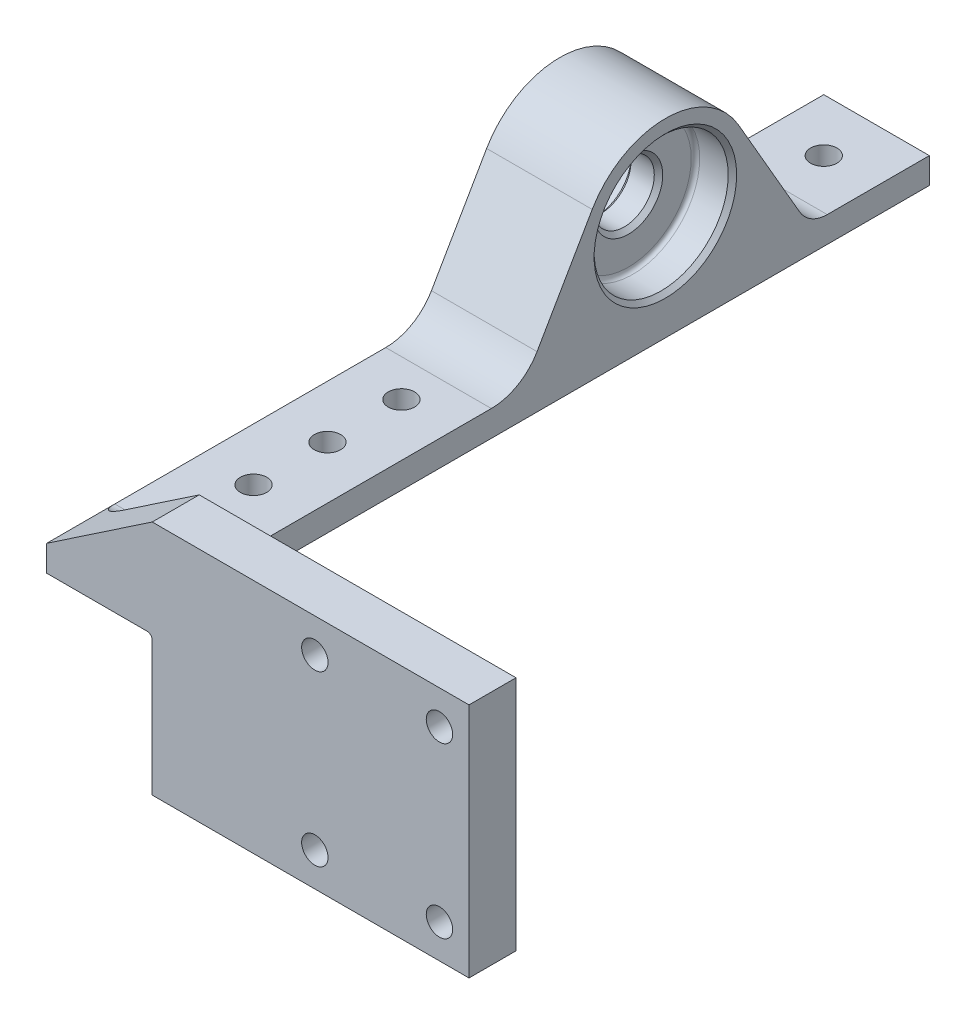
ISO-10303-21;
HEADER;
FILE_DESCRIPTION(('STEP AP214'),'2;1');
FILE_NAME('part.step','',(''),(''),'','','');
FILE_SCHEMA(('AUTOMOTIVE_DESIGN { 1 0 10303 214 1 1 1 1 }'));
ENDSEC;
DATA;
#1=APPLICATION_CONTEXT('core data for automotive mechanical design processes');
#2=APPLICATION_PROTOCOL_DEFINITION('international standard','automotive_design',2000,#1);
#3=PRODUCT_CONTEXT('',#1,'mechanical');
#4=PRODUCT('Part','Part','',(#3));
#5=PRODUCT_RELATED_PRODUCT_CATEGORY('part','',(#4));
#6=PRODUCT_DEFINITION_FORMATION('','',#4);
#7=PRODUCT_DEFINITION_CONTEXT('part definition',#1,'design');
#8=PRODUCT_DEFINITION('design','',#6,#7);
#9=PRODUCT_DEFINITION_SHAPE('','',#8);
#10=(LENGTH_UNIT() NAMED_UNIT(*) SI_UNIT(.MILLI.,.METRE.));
#11=(NAMED_UNIT(*) PLANE_ANGLE_UNIT() SI_UNIT($,.RADIAN.));
#12=(NAMED_UNIT(*) SI_UNIT($,.STERADIAN.) SOLID_ANGLE_UNIT());
#13=UNCERTAINTY_MEASURE_WITH_UNIT(LENGTH_MEASURE(1.E-05),#10,'distance_accuracy_value','');
#14=(GEOMETRIC_REPRESENTATION_CONTEXT(3) GLOBAL_UNCERTAINTY_ASSIGNED_CONTEXT((#13)) GLOBAL_UNIT_ASSIGNED_CONTEXT((#10,
#11,#12)) REPRESENTATION_CONTEXT('',''));
#15=CARTESIAN_POINT('',(0.,0.,0.));
#16=DIRECTION('',(0.,0.,1.));
#17=DIRECTION('',(1.,0.,0.));
#18=AXIS2_PLACEMENT_3D('',#15,#16,#17);
#19=CARTESIAN_POINT('',(6.35,3.1115,112.517680526058));
#20=DIRECTION('',(0.,-1.,0.));
#21=DIRECTION('',(0.,0.,-1.));
#22=AXIS2_PLACEMENT_3D('',#19,#20,#21);
#23=PLANE('',#22);
#24=CARTESIAN_POINT('',(0.,3.1115,76.2));
#25=DIRECTION('',(0.,1.,0.));
#26=DIRECTION('',(0.,0.,1.));
#27=AXIS2_PLACEMENT_3D('',#24,#25,#26);
#28=CIRCLE('',#27,1.5875);
#29=CARTESIAN_POINT('',(0.,3.1115,77.7875));
#30=VERTEX_POINT('',#29);
#31=EDGE_CURVE('E445',#30,#30,#28,.T.);
#32=ORIENTED_EDGE('',*,*,#31,.F.);
#33=EDGE_LOOP('',(#32));
#34=FACE_BOUND('',#33,.T.);
#35=CARTESIAN_POINT('',(0.,3.1115,85.09));
#36=DIRECTION('',(0.,1.,0.));
#37=DIRECTION('',(0.,0.,1.));
#38=AXIS2_PLACEMENT_3D('',#35,#36,#37);
#39=CIRCLE('',#38,1.5875);
#40=CARTESIAN_POINT('',(0.,3.1115,86.6775));
#41=VERTEX_POINT('',#40);
#42=EDGE_CURVE('E442',#41,#41,#39,.T.);
#43=ORIENTED_EDGE('',*,*,#42,.F.);
#44=EDGE_LOOP('',(#43));
#45=FACE_BOUND('',#44,.T.);
#46=CARTESIAN_POINT('',(0.,3.1115,93.98));
#47=DIRECTION('',(0.,1.,0.));
#48=DIRECTION('',(0.,0.,1.));
#49=AXIS2_PLACEMENT_3D('',#46,#47,#48);
#50=CIRCLE('',#49,1.5875);
#51=CARTESIAN_POINT('',(0.,3.1115,95.5675));
#52=VERTEX_POINT('',#51);
#53=EDGE_CURVE('E439',#52,#52,#50,.T.);
#54=ORIENTED_EDGE('',*,*,#53,.F.);
#55=EDGE_LOOP('',(#54));
#56=FACE_BOUND('',#55,.T.);
#57=DIRECTION('',(0.,0.,1.));
#58=VECTOR('',#57,1.);
#59=CARTESIAN_POINT('',(-6.35,3.1115,112.517680526058));
#60=LINE('',#59,#58);
#61=CARTESIAN_POINT('',(-6.35,3.1115,71.7338547354119));
#62=VERTEX_POINT('',#61);
#63=CARTESIAN_POINT('',(-6.35,3.1115,104.325224808111));
#64=VERTEX_POINT('',#63);
#65=EDGE_CURVE('E248',#62,#64,#60,.T.);
#66=ORIENTED_EDGE('',*,*,#65,.T.);
#67=DIRECTION('',(-1.,0.,0.));
#68=VECTOR('',#67,1.);
#69=CARTESIAN_POINT('',(6.35,3.1115,104.325224808111));
#70=LINE('',#69,#68);
#71=CARTESIAN_POINT('',(6.35,3.1115,104.325224808111));
#72=VERTEX_POINT('',#71);
#73=EDGE_CURVE('E67',#64,#72,#70,.F.);
#74=ORIENTED_EDGE('',*,*,#73,.T.);
#75=DIRECTION('',(0.,0.,1.));
#76=VECTOR('',#75,1.);
#77=CARTESIAN_POINT('',(6.35,3.1115,112.517680526058));
#78=LINE('',#77,#76);
#79=CARTESIAN_POINT('',(6.35,3.1115,71.7338547354119));
#80=VERTEX_POINT('',#79);
#81=EDGE_CURVE('E231',#80,#72,#78,.T.);
#82=ORIENTED_EDGE('',*,*,#81,.F.);
#83=DIRECTION('',(-1.,0.,0.));
#84=VECTOR('',#83,1.);
#85=CARTESIAN_POINT('',(-6.35,3.1115,71.7338547354119));
#86=LINE('',#85,#84);
#87=EDGE_CURVE('E266',#80,#62,#86,.T.);
#88=ORIENTED_EDGE('',*,*,#87,.T.);
#89=EDGE_LOOP('',(#66,#74,#82,#88));
#90=FACE_BOUND('',#89,.T.);
#91=ADVANCED_FACE('F45',(#34,#45,#56,#90),#23,.F.);
#92=CARTESIAN_POINT('',(6.35,12.7,50.8));
#93=DIRECTION('',(-1.,0.,0.));
#94=DIRECTION('',(0.,0.,1.));
#95=AXIS2_PLACEMENT_3D('',#92,#93,#94);
#96=CYLINDRICAL_SURFACE('',#95,3.6195);
#97=CARTESIAN_POINT('',(-1.39699999999999,12.7,50.8));
#98=DIRECTION('',(-1.,0.,0.));
#99=DIRECTION('',(0.,0.,1.));
#100=AXIS2_PLACEMENT_3D('',#97,#98,#99);
#101=CIRCLE('',#100,3.6195);
#102=CARTESIAN_POINT('',(-1.39699999999999,12.7,54.4195));
#103=VERTEX_POINT('',#102);
#104=EDGE_CURVE('E296',#103,#103,#101,.T.);
#105=ORIENTED_EDGE('',*,*,#104,.T.);
#106=EDGE_LOOP('',(#105));
#107=FACE_BOUND('',#106,.T.);
#108=CARTESIAN_POINT('',(1.39699999999999,12.7,50.8));
#109=DIRECTION('',(1.,0.,0.));
#110=DIRECTION('',(0.,0.,-1.));
#111=AXIS2_PLACEMENT_3D('',#108,#109,#110);
#112=CIRCLE('',#111,3.6195);
#113=CARTESIAN_POINT('',(1.39699999999999,12.7,47.1805));
#114=VERTEX_POINT('',#113);
#115=EDGE_CURVE('E293',#114,#114,#112,.T.);
#116=ORIENTED_EDGE('',*,*,#115,.T.);
#117=EDGE_LOOP('',(#116));
#118=FACE_BOUND('',#117,.T.);
#119=ADVANCED_FACE('F465',(#107,#118),#96,.F.);
#120=CARTESIAN_POINT('',(6.35,12.7,50.8));
#121=DIRECTION('',(1.,0.,0.));
#122=DIRECTION('',(0.,0.,-1.));
#123=AXIS2_PLACEMENT_3D('',#120,#121,#122);
#124=PLANE('',#123);
#125=DIRECTION('',(0.,1.,0.));
#126=VECTOR('',#125,1.);
#127=CARTESIAN_POINT('',(6.35,-16.764,106.86522480811));
#128=LINE('',#127,#126);
#129=CARTESIAN_POINT('',(6.35,0.,106.86522480811));
#130=VERTEX_POINT('',#129);
#131=CARTESIAN_POINT('',(6.35,5.6515,106.86522480811));
#132=VERTEX_POINT('',#131);
#133=EDGE_CURVE('E210',#130,#132,#128,.T.);
#134=ORIENTED_EDGE('',*,*,#133,.F.);
#135=DIRECTION('',(0.,0.,-1.));
#136=VECTOR('',#135,1.);
#137=CARTESIAN_POINT('',(6.35,0.,19.05));
#138=LINE('',#137,#136);
#139=CARTESIAN_POINT('',(6.35,0.,19.05));
#140=VERTEX_POINT('',#139);
#141=EDGE_CURVE('E233',#130,#140,#138,.T.);
#142=ORIENTED_EDGE('',*,*,#141,.T.);
#143=DIRECTION('',(0.,1.,0.));
#144=VECTOR('',#143,1.);
#145=CARTESIAN_POINT('',(6.35,3.1115,19.05));
#146=LINE('',#145,#144);
#147=CARTESIAN_POINT('',(6.35,3.1115,19.05));
#148=VERTEX_POINT('',#147);
#149=EDGE_CURVE('E217',#140,#148,#146,.T.);
#150=ORIENTED_EDGE('',*,*,#149,.T.);
#151=DIRECTION('',(0.,0.,1.));
#152=VECTOR('',#151,1.);
#153=CARTESIAN_POINT('',(6.35,3.1115,19.05));
#154=LINE('',#153,#152);
#155=CARTESIAN_POINT('',(6.35,3.1115,31.3326149483297));
#156=VERTEX_POINT('',#155);
#157=EDGE_CURVE('E220',#148,#156,#154,.T.);
#158=ORIENTED_EDGE('',*,*,#157,.T.);
#159=CARTESIAN_POINT('',(6.35,6.9215,31.3326149483297));
#160=DIRECTION('',(1.,0.,0.));
#161=DIRECTION('',(0.,0.,-1.));
#162=AXIS2_PLACEMENT_3D('',#159,#160,#161);
#163=CIRCLE('',#162,3.81);
#164=CARTESIAN_POINT('',(6.35,5.01650000000002,34.6321717367484));
#165=VERTEX_POINT('',#164);
#166=EDGE_CURVE('E318',#156,#165,#163,.F.);
#167=ORIENTED_EDGE('',*,*,#166,.T.);
#168=DIRECTION('',(0.,0.866025403784442,0.499999999999994));
#169=VECTOR('',#168,1.);
#170=CARTESIAN_POINT('',(6.35,3.1115,33.5323194739422));
#171=LINE('',#170,#169);
#172=CARTESIAN_POINT('',(6.35,17.7799999999999,42.00118189755));
#173=VERTEX_POINT('',#172);
#174=EDGE_CURVE('E224',#165,#173,#171,.T.);
#175=ORIENTED_EDGE('',*,*,#174,.T.);
#176=CARTESIAN_POINT('',(6.35,12.7,50.8));
#177=DIRECTION('',(1.,0.,0.));
#178=DIRECTION('',(0.,0.,-1.));
#179=AXIS2_PLACEMENT_3D('',#176,#177,#178);
#180=CIRCLE('',#179,10.16);
#181=CARTESIAN_POINT('',(6.35,17.7799999999999,59.5988181024499));
#182=VERTEX_POINT('',#181);
#183=EDGE_CURVE('E226',#173,#182,#180,.T.);
#184=ORIENTED_EDGE('',*,*,#183,.T.);
#185=DIRECTION('',(0.,-0.866025403784442,0.499999999999995));
#186=VECTOR('',#185,1.);
#187=CARTESIAN_POINT('',(6.35,3.1115,68.0676805260578));
#188=LINE('',#187,#186);
#189=CARTESIAN_POINT('',(6.35,6.28650000000003,66.2345934213807));
#190=VERTEX_POINT('',#189);
#191=EDGE_CURVE('E228',#182,#190,#188,.T.);
#192=ORIENTED_EDGE('',*,*,#191,.T.);
#193=CARTESIAN_POINT('',(6.35,9.4615,71.7338547354119));
#194=DIRECTION('',(1.,0.,0.));
#195=DIRECTION('',(0.,0.,-1.));
#196=AXIS2_PLACEMENT_3D('',#193,#194,#195);
#197=CIRCLE('',#196,6.35);
#198=EDGE_CURVE('E273',#190,#80,#197,.F.);
#199=ORIENTED_EDGE('',*,*,#198,.T.);
#200=ORIENTED_EDGE('',*,*,#81,.T.);
#201=CARTESIAN_POINT('',(6.35,5.6515,104.325224808111));
#202=DIRECTION('',(1.,0.,0.));
#203=DIRECTION('',(0.,0.,-1.));
#204=AXIS2_PLACEMENT_3D('',#201,#202,#203);
#205=CIRCLE('',#204,2.54);
#206=EDGE_CURVE('E11',#72,#132,#205,.F.);
#207=ORIENTED_EDGE('',*,*,#206,.T.);
#208=EDGE_LOOP('',(#134,#142,#150,#158,#167,#175,#184,#192,#199,#200,#207));
#209=FACE_BOUND('',#208,.T.);
#210=CARTESIAN_POINT('',(6.35,12.7,50.8));
#211=DIRECTION('',(1.,0.,0.));
#212=DIRECTION('',(0.,0.,-1.));
#213=AXIS2_PLACEMENT_3D('',#210,#211,#212);
#214=CIRCLE('',#213,8.57250000000001);
#215=CARTESIAN_POINT('',(6.35,12.7,42.2275));
#216=VERTEX_POINT('',#215);
#217=EDGE_CURVE('E308',#216,#216,#214,.F.);
#218=ORIENTED_EDGE('',*,*,#217,.T.);
#219=EDGE_LOOP('',(#218));
#220=FACE_BOUND('',#219,.T.);
#221=ADVANCED_FACE('F354',(#209,#220),#124,.T.);
#222=CARTESIAN_POINT('',(-6.35,12.7,50.8));
#223=DIRECTION('',(1.,0.,0.));
#224=DIRECTION('',(0.,0.,-1.));
#225=AXIS2_PLACEMENT_3D('',#222,#223,#224);
#226=PLANE('',#225);
#227=CARTESIAN_POINT('',(-6.35,12.7,50.8));
#228=DIRECTION('',(1.,0.,0.));
#229=DIRECTION('',(0.,0.,-1.));
#230=AXIS2_PLACEMENT_3D('',#227,#228,#229);
#231=CIRCLE('',#230,8.57250000000001);
#232=CARTESIAN_POINT('',(-6.35,12.7,42.2275));
#233=VERTEX_POINT('',#232);
#234=EDGE_CURVE('E287',#233,#233,#231,.T.);
#235=ORIENTED_EDGE('',*,*,#234,.T.);
#236=EDGE_LOOP('',(#235));
#237=FACE_BOUND('',#236,.T.);
#238=DIRECTION('',(0.,1.,0.));
#239=VECTOR('',#238,1.);
#240=CARTESIAN_POINT('',(-6.35,3.1115,19.05));
#241=LINE('',#240,#239);
#242=CARTESIAN_POINT('',(-6.35,0.,19.05));
#243=VERTEX_POINT('',#242);
#244=CARTESIAN_POINT('',(-6.35,3.1115,19.05));
#245=VERTEX_POINT('',#244);
#246=EDGE_CURVE('E189',#243,#245,#241,.T.);
#247=ORIENTED_EDGE('',*,*,#246,.F.);
#248=DIRECTION('',(0.,0.,-1.));
#249=VECTOR('',#248,1.);
#250=CARTESIAN_POINT('',(-6.35,0.,19.05));
#251=LINE('',#250,#249);
#252=CARTESIAN_POINT('',(-6.35,0.,112.517680526058));
#253=VERTEX_POINT('',#252);
#254=EDGE_CURVE('E221',#253,#243,#251,.T.);
#255=ORIENTED_EDGE('',*,*,#254,.F.);
#256=DIRECTION('',(0.,-1.,0.));
#257=VECTOR('',#256,1.);
#258=CARTESIAN_POINT('',(-6.35,0.,112.517680526058));
#259=LINE('',#258,#257);
#260=CARTESIAN_POINT('',(-6.35,3.1115,112.517680526058));
#261=VERTEX_POINT('',#260);
#262=EDGE_CURVE('E250',#261,#253,#259,.T.);
#263=ORIENTED_EDGE('',*,*,#262,.F.);
#264=DIRECTION('',(0.,0.,1.));
#265=VECTOR('',#264,1.);
#266=CARTESIAN_POINT('',(-6.35,3.1115,91.5427655978532));
#267=LINE('',#266,#265);
#268=EDGE_CURVE('E60',#64,#261,#267,.T.);
#269=ORIENTED_EDGE('',*,*,#268,.F.);
#270=ORIENTED_EDGE('',*,*,#65,.F.);
#271=CARTESIAN_POINT('',(-6.35,9.4615,71.7338547354119));
#272=DIRECTION('',(1.,0.,0.));
#273=DIRECTION('',(0.,0.,-1.));
#274=AXIS2_PLACEMENT_3D('',#271,#272,#273);
#275=CIRCLE('',#274,6.35);
#276=CARTESIAN_POINT('',(-6.35,6.28650000000003,66.2345934213807));
#277=VERTEX_POINT('',#276);
#278=EDGE_CURVE('E271',#62,#277,#275,.T.);
#279=ORIENTED_EDGE('',*,*,#278,.T.);
#280=DIRECTION('',(0.,-0.866025403784442,0.499999999999995));
#281=VECTOR('',#280,1.);
#282=CARTESIAN_POINT('',(-6.35,3.1115,68.0676805260578));
#283=LINE('',#282,#281);
#284=CARTESIAN_POINT('',(-6.35,17.7799999999999,59.5988181024499));
#285=VERTEX_POINT('',#284);
#286=EDGE_CURVE('E245',#285,#277,#283,.T.);
#287=ORIENTED_EDGE('',*,*,#286,.F.);
#288=CARTESIAN_POINT('',(-6.35,12.7,50.8));
#289=DIRECTION('',(1.,0.,0.));
#290=DIRECTION('',(0.,0.,-1.));
#291=AXIS2_PLACEMENT_3D('',#288,#289,#290);
#292=CIRCLE('',#291,10.16);
#293=CARTESIAN_POINT('',(-6.35,17.7799999999999,42.00118189755));
#294=VERTEX_POINT('',#293);
#295=EDGE_CURVE('E243',#294,#285,#292,.T.);
#296=ORIENTED_EDGE('',*,*,#295,.F.);
#297=DIRECTION('',(0.,0.866025403784442,0.499999999999994));
#298=VECTOR('',#297,1.);
#299=CARTESIAN_POINT('',(-6.35,3.1115,33.5323194739422));
#300=LINE('',#299,#298);
#301=CARTESIAN_POINT('',(-6.35,5.01650000000002,34.6321717367484));
#302=VERTEX_POINT('',#301);
#303=EDGE_CURVE('E241',#302,#294,#300,.T.);
#304=ORIENTED_EDGE('',*,*,#303,.F.);
#305=CARTESIAN_POINT('',(-6.35,6.9215,31.3326149483297));
#306=DIRECTION('',(1.,0.,0.));
#307=DIRECTION('',(0.,0.,-1.));
#308=AXIS2_PLACEMENT_3D('',#305,#306,#307);
#309=CIRCLE('',#308,3.81);
#310=CARTESIAN_POINT('',(-6.35,3.1115,31.3326149483297));
#311=VERTEX_POINT('',#310);
#312=EDGE_CURVE('E316',#302,#311,#309,.T.);
#313=ORIENTED_EDGE('',*,*,#312,.T.);
#314=DIRECTION('',(0.,0.,1.));
#315=VECTOR('',#314,1.);
#316=CARTESIAN_POINT('',(-6.35,3.1115,19.05));
#317=LINE('',#316,#315);
#318=EDGE_CURVE('E238',#245,#311,#317,.T.);
#319=ORIENTED_EDGE('',*,*,#318,.F.);
#320=EDGE_LOOP('',(#247,#255,#263,#269,#270,#279,#287,#296,#304,#313,#319));
#321=FACE_BOUND('',#320,.T.);
#322=ADVANCED_FACE('F363',(#237,#321),#226,.F.);
#323=CARTESIAN_POINT('',(6.35,3.1115,19.05));
#324=DIRECTION('',(0.,0.,1.));
#325=DIRECTION('',(1.,0.,0.));
#326=AXIS2_PLACEMENT_3D('',#323,#324,#325);
#327=PLANE('',#326);
#328=ORIENTED_EDGE('',*,*,#246,.T.);
#329=DIRECTION('',(-1.,0.,0.));
#330=VECTOR('',#329,1.);
#331=CARTESIAN_POINT('',(6.35,3.1115,19.05));
#332=LINE('',#331,#330);
#333=EDGE_CURVE('E263',#148,#245,#332,.T.);
#334=ORIENTED_EDGE('',*,*,#333,.F.);
#335=ORIENTED_EDGE('',*,*,#149,.F.);
#336=DIRECTION('',(-1.,0.,0.));
#337=VECTOR('',#336,1.);
#338=CARTESIAN_POINT('',(6.35,0.,19.05));
#339=LINE('',#338,#337);
#340=EDGE_CURVE('E235',#140,#243,#339,.T.);
#341=ORIENTED_EDGE('',*,*,#340,.T.);
#342=EDGE_LOOP('',(#328,#334,#335,#341));
#343=FACE_BOUND('',#342,.T.);
#344=ADVANCED_FACE('F389',(#343),#327,.F.);
#345=CARTESIAN_POINT('',(6.35,3.1115,19.05));
#346=DIRECTION('',(0.,-1.,0.));
#347=DIRECTION('',(0.,0.,-1.));
#348=AXIS2_PLACEMENT_3D('',#345,#346,#347);
#349=PLANE('',#348);
#350=CARTESIAN_POINT('',(0.,3.1115,25.4));
#351=DIRECTION('',(0.,1.,0.));
#352=DIRECTION('',(0.,0.,1.));
#353=AXIS2_PLACEMENT_3D('',#350,#351,#352);
#354=CIRCLE('',#353,1.5875);
#355=CARTESIAN_POINT('',(0.,3.1115,26.9875));
#356=VERTEX_POINT('',#355);
#357=EDGE_CURVE('E337',#356,#356,#354,.T.);
#358=ORIENTED_EDGE('',*,*,#357,.F.);
#359=EDGE_LOOP('',(#358));
#360=FACE_BOUND('',#359,.T.);
#361=ORIENTED_EDGE('',*,*,#318,.T.);
#362=DIRECTION('',(-1.,0.,0.));
#363=VECTOR('',#362,1.);
#364=CARTESIAN_POINT('',(6.35,3.1115,31.3326149483297));
#365=LINE('',#364,#363);
#366=EDGE_CURVE('E314',#311,#156,#365,.F.);
#367=ORIENTED_EDGE('',*,*,#366,.T.);
#368=ORIENTED_EDGE('',*,*,#157,.F.);
#369=ORIENTED_EDGE('',*,*,#333,.T.);
#370=EDGE_LOOP('',(#361,#367,#368,#369));
#371=FACE_BOUND('',#370,.T.);
#372=ADVANCED_FACE('F383',(#360,#371),#349,.F.);
#373=CARTESIAN_POINT('',(6.35,3.1115,33.5323194739422));
#374=DIRECTION('',(0.,-0.499999999999994,0.866025403784442));
#375=DIRECTION('',(0.,-0.866025403784442,-0.499999999999994));
#376=AXIS2_PLACEMENT_3D('',#373,#374,#375);
#377=PLANE('',#376);
#378=ORIENTED_EDGE('',*,*,#174,.F.);
#379=DIRECTION('',(-1.,0.,0.));
#380=VECTOR('',#379,1.);
#381=CARTESIAN_POINT('',(-6.35,5.01650000000002,34.6321717367484));
#382=LINE('',#381,#380);
#383=EDGE_CURVE('E311',#165,#302,#382,.T.);
#384=ORIENTED_EDGE('',*,*,#383,.T.);
#385=ORIENTED_EDGE('',*,*,#303,.T.);
#386=DIRECTION('',(-1.,0.,0.));
#387=VECTOR('',#386,1.);
#388=CARTESIAN_POINT('',(6.35,17.7799999999999,42.00118189755));
#389=LINE('',#388,#387);
#390=EDGE_CURVE('E260',#173,#294,#389,.T.);
#391=ORIENTED_EDGE('',*,*,#390,.F.);
#392=EDGE_LOOP('',(#378,#384,#385,#391));
#393=FACE_BOUND('',#392,.T.);
#394=ADVANCED_FACE('F376',(#393),#377,.F.);
#395=CARTESIAN_POINT('',(6.35,12.7,50.8));
#396=DIRECTION('',(-1.,0.,0.));
#397=DIRECTION('',(0.,0.,1.));
#398=AXIS2_PLACEMENT_3D('',#395,#396,#397);
#399=CYLINDRICAL_SURFACE('',#398,10.16);
#400=ORIENTED_EDGE('',*,*,#295,.T.);
#401=DIRECTION('',(-1.,0.,0.));
#402=VECTOR('',#401,1.);
#403=CARTESIAN_POINT('',(6.35,17.7799999999999,59.5988181024499));
#404=LINE('',#403,#402);
#405=EDGE_CURVE('E257',#182,#285,#404,.T.);
#406=ORIENTED_EDGE('',*,*,#405,.F.);
#407=ORIENTED_EDGE('',*,*,#183,.F.);
#408=ORIENTED_EDGE('',*,*,#390,.T.);
#409=EDGE_LOOP('',(#400,#406,#407,#408));
#410=FACE_BOUND('',#409,.T.);
#411=ADVANCED_FACE('F371',(#410),#399,.T.);
#412=CARTESIAN_POINT('',(6.35,3.1115,68.0676805260578));
#413=DIRECTION('',(0.,-0.499999999999995,-0.866025403784442));
#414=DIRECTION('',(0.,0.866025403784442,-0.499999999999995));
#415=AXIS2_PLACEMENT_3D('',#412,#413,#414);
#416=PLANE('',#415);
#417=ORIENTED_EDGE('',*,*,#286,.T.);
#418=DIRECTION('',(-1.,0.,0.));
#419=VECTOR('',#418,1.);
#420=CARTESIAN_POINT('',(6.35,6.28650000000003,66.2345934213807));
#421=LINE('',#420,#419);
#422=EDGE_CURVE('E269',#277,#190,#421,.F.);
#423=ORIENTED_EDGE('',*,*,#422,.T.);
#424=ORIENTED_EDGE('',*,*,#191,.F.);
#425=ORIENTED_EDGE('',*,*,#405,.T.);
#426=EDGE_LOOP('',(#417,#423,#424,#425));
#427=FACE_BOUND('',#426,.T.);
#428=ADVANCED_FACE('F366',(#427),#416,.F.);
#429=CARTESIAN_POINT('',(6.35,0.,112.517680526058));
#430=DIRECTION('',(0.,0.,-1.));
#431=DIRECTION('',(-1.,0.,0.));
#432=AXIS2_PLACEMENT_3D('',#429,#430,#431);
#433=PLANE('',#432);
#434=CARTESIAN_POINT('',(25.908,7.62000000000001,112.517680526058));
#435=DIRECTION('',(0.,0.,-1.));
#436=DIRECTION('',(-1.,0.,0.));
#437=AXIS2_PLACEMENT_3D('',#434,#435,#436);
#438=CIRCLE('',#437,1.5875);
#439=CARTESIAN_POINT('',(24.3205,7.62000000000001,112.517680526058));
#440=VERTEX_POINT('',#439);
#441=EDGE_CURVE('E430',#440,#440,#438,.T.);
#442=ORIENTED_EDGE('',*,*,#441,.T.);
#443=EDGE_LOOP('',(#442));
#444=FACE_BOUND('',#443,.T.);
#445=CARTESIAN_POINT('',(40.894,-12.7,112.517680526058));
#446=DIRECTION('',(0.,0.,-1.));
#447=DIRECTION('',(-1.,0.,0.));
#448=AXIS2_PLACEMENT_3D('',#445,#446,#447);
#449=CIRCLE('',#448,1.5875);
#450=CARTESIAN_POINT('',(39.3065,-12.7,112.517680526058));
#451=VERTEX_POINT('',#450);
#452=EDGE_CURVE('E423',#451,#451,#449,.T.);
#453=ORIENTED_EDGE('',*,*,#452,.T.);
#454=EDGE_LOOP('',(#453));
#455=FACE_BOUND('',#454,.T.);
#456=CARTESIAN_POINT('',(25.908,-12.7,112.517680526058));
#457=DIRECTION('',(0.,0.,-1.));
#458=DIRECTION('',(-1.,0.,0.));
#459=AXIS2_PLACEMENT_3D('',#456,#457,#458);
#460=CIRCLE('',#459,1.5875);
#461=CARTESIAN_POINT('',(24.3205,-12.7,112.517680526058));
#462=VERTEX_POINT('',#461);
#463=EDGE_CURVE('E346',#462,#462,#460,.T.);
#464=ORIENTED_EDGE('',*,*,#463,.T.);
#465=EDGE_LOOP('',(#464));
#466=FACE_BOUND('',#465,.T.);
#467=CARTESIAN_POINT('',(40.894,7.62000000000001,112.517680526058));
#468=DIRECTION('',(0.,0.,-1.));
#469=DIRECTION('',(-1.,0.,0.));
#470=AXIS2_PLACEMENT_3D('',#467,#468,#469);
#471=CIRCLE('',#470,1.5875);
#472=CARTESIAN_POINT('',(39.3065,7.62000000000001,112.517680526058));
#473=VERTEX_POINT('',#472);
#474=EDGE_CURVE('E179',#473,#473,#471,.T.);
#475=ORIENTED_EDGE('',*,*,#474,.T.);
#476=EDGE_LOOP('',(#475));
#477=FACE_BOUND('',#476,.T.);
#478=DIRECTION('',(-0.828848674075648,-0.559472855001062,0.));
#479=VECTOR('',#478,1.);
#480=CARTESIAN_POINT('',(6.35,11.684,112.517680526058));
#481=LINE('',#480,#479);
#482=CARTESIAN_POINT('',(6.35,11.684,112.517680526058));
#483=VERTEX_POINT('',#482);
#484=EDGE_CURVE('E169',#483,#261,#481,.T.);
#485=ORIENTED_EDGE('',*,*,#484,.T.);
#486=ORIENTED_EDGE('',*,*,#262,.T.);
#487=DIRECTION('',(-1.,0.,0.));
#488=VECTOR('',#487,1.);
#489=CARTESIAN_POINT('',(6.35,0.,112.517680526058));
#490=LINE('',#489,#488);
#491=CARTESIAN_POINT('',(5.715,0.,112.517680526058));
#492=VERTEX_POINT('',#491);
#493=EDGE_CURVE('E255',#492,#253,#490,.T.);
#494=ORIENTED_EDGE('',*,*,#493,.F.);
#495=CARTESIAN_POINT('',(5.715,-0.635,112.517680526058));
#496=DIRECTION('',(0.,0.,-1.));
#497=DIRECTION('',(-1.,0.,0.));
#498=AXIS2_PLACEMENT_3D('',#495,#496,#497);
#499=CIRCLE('',#498,0.635);
#500=CARTESIAN_POINT('',(6.35,-0.635,112.517680526058));
#501=VERTEX_POINT('',#500);
#502=EDGE_CURVE('E330',#492,#501,#499,.T.);
#503=ORIENTED_EDGE('',*,*,#502,.T.);
#504=DIRECTION('',(0.,-1.,0.));
#505=VECTOR('',#504,1.);
#506=CARTESIAN_POINT('',(6.35,11.684,112.517680526058));
#507=LINE('',#506,#505);
#508=CARTESIAN_POINT('',(6.35,-16.764,112.517680526058));
#509=VERTEX_POINT('',#508);
#510=EDGE_CURVE('E195',#501,#509,#507,.T.);
#511=ORIENTED_EDGE('',*,*,#510,.T.);
#512=DIRECTION('',(-1.,0.,0.));
#513=VECTOR('',#512,1.);
#514=CARTESIAN_POINT('',(44.45,-16.764,112.517680526058));
#515=LINE('',#514,#513);
#516=CARTESIAN_POINT('',(44.45,-16.764,112.517680526058));
#517=VERTEX_POINT('',#516);
#518=EDGE_CURVE('E190',#517,#509,#515,.T.);
#519=ORIENTED_EDGE('',*,*,#518,.F.);
#520=DIRECTION('',(0.,-1.,0.));
#521=VECTOR('',#520,1.);
#522=CARTESIAN_POINT('',(44.45,11.684,112.517680526058));
#523=LINE('',#522,#521);
#524=CARTESIAN_POINT('',(44.45,11.684,112.517680526058));
#525=VERTEX_POINT('',#524);
#526=EDGE_CURVE('E185',#525,#517,#523,.T.);
#527=ORIENTED_EDGE('',*,*,#526,.F.);
#528=DIRECTION('',(-1.,0.,0.));
#529=VECTOR('',#528,1.);
#530=CARTESIAN_POINT('',(44.45,11.684,112.517680526058));
#531=LINE('',#530,#529);
#532=EDGE_CURVE('E182',#525,#483,#531,.T.);
#533=ORIENTED_EDGE('',*,*,#532,.T.);
#534=EDGE_LOOP('',(#485,#486,#494,#503,#511,#519,#527,#533));
#535=FACE_BOUND('',#534,.T.);
#536=ADVANCED_FACE('F183',(#444,#455,#466,#477,#535),#433,.F.);
#537=CARTESIAN_POINT('',(6.35,0.,19.05));
#538=DIRECTION('',(0.,1.,0.));
#539=DIRECTION('',(0.,0.,1.));
#540=AXIS2_PLACEMENT_3D('',#537,#538,#539);
#541=PLANE('',#540);
#542=CARTESIAN_POINT('',(0.,0.,25.4));
#543=DIRECTION('',(0.,1.,0.));
#544=DIRECTION('',(0.,0.,1.));
#545=AXIS2_PLACEMENT_3D('',#542,#543,#544);
#546=CIRCLE('',#545,1.5875);
#547=CARTESIAN_POINT('',(0.,0.,26.9875));
#548=VERTEX_POINT('',#547);
#549=EDGE_CURVE('E343',#548,#548,#546,.T.);
#550=ORIENTED_EDGE('',*,*,#549,.T.);
#551=EDGE_LOOP('',(#550));
#552=FACE_BOUND('',#551,.T.);
#553=CARTESIAN_POINT('',(0.,0.,76.2));
#554=DIRECTION('',(0.,1.,0.));
#555=DIRECTION('',(0.,0.,1.));
#556=AXIS2_PLACEMENT_3D('',#553,#554,#555);
#557=CIRCLE('',#556,1.5875);
#558=CARTESIAN_POINT('',(0.,0.,77.7875));
#559=VERTEX_POINT('',#558);
#560=EDGE_CURVE('E340',#559,#559,#557,.T.);
#561=ORIENTED_EDGE('',*,*,#560,.T.);
#562=EDGE_LOOP('',(#561));
#563=FACE_BOUND('',#562,.T.);
#564=CARTESIAN_POINT('',(0.,0.,85.09));
#565=DIRECTION('',(0.,1.,0.));
#566=DIRECTION('',(0.,0.,1.));
#567=AXIS2_PLACEMENT_3D('',#564,#565,#566);
#568=CIRCLE('',#567,1.5875);
#569=CARTESIAN_POINT('',(0.,0.,86.6775));
#570=VERTEX_POINT('',#569);
#571=EDGE_CURVE('E336',#570,#570,#568,.T.);
#572=ORIENTED_EDGE('',*,*,#571,.T.);
#573=EDGE_LOOP('',(#572));
#574=FACE_BOUND('',#573,.T.);
#575=CARTESIAN_POINT('',(0.,0.,93.98));
#576=DIRECTION('',(0.,1.,0.));
#577=DIRECTION('',(0.,0.,1.));
#578=AXIS2_PLACEMENT_3D('',#575,#576,#577);
#579=CIRCLE('',#578,1.5875);
#580=CARTESIAN_POINT('',(0.,0.,95.5675));
#581=VERTEX_POINT('',#580);
#582=EDGE_CURVE('E333',#581,#581,#579,.T.);
#583=ORIENTED_EDGE('',*,*,#582,.T.);
#584=EDGE_LOOP('',(#583));
#585=FACE_BOUND('',#584,.T.);
#586=ORIENTED_EDGE('',*,*,#141,.F.);
#587=DIRECTION('',(-1.,0.,0.));
#588=VECTOR('',#587,1.);
#589=CARTESIAN_POINT('',(44.45,0.,106.86522480811));
#590=LINE('',#589,#588);
#591=CARTESIAN_POINT('',(5.715,0.,106.86522480811));
#592=VERTEX_POINT('',#591);
#593=EDGE_CURVE('E325',#130,#592,#590,.T.);
#594=ORIENTED_EDGE('',*,*,#593,.T.);
#595=DIRECTION('',(0.,0.,-1.));
#596=VECTOR('',#595,1.);
#597=CARTESIAN_POINT('',(5.715,0.,112.517680526058));
#598=LINE('',#597,#596);
#599=EDGE_CURVE('E323',#592,#492,#598,.F.);
#600=ORIENTED_EDGE('',*,*,#599,.T.);
#601=ORIENTED_EDGE('',*,*,#493,.T.);
#602=ORIENTED_EDGE('',*,*,#254,.T.);
#603=ORIENTED_EDGE('',*,*,#340,.F.);
#604=EDGE_LOOP('',(#586,#594,#600,#601,#602,#603));
#605=FACE_BOUND('',#604,.T.);
#606=ADVANCED_FACE('F392',(#552,#563,#574,#585,#605),#541,.F.);
#607=CARTESIAN_POINT('',(1.905,12.7,50.8));
#608=DIRECTION('',(1.,0.,0.));
#609=DIRECTION('',(0.,0.,-1.));
#610=AXIS2_PLACEMENT_3D('',#607,#608,#609);
#611=CYLINDRICAL_SURFACE('',#610,8.0645);
#612=CARTESIAN_POINT('',(5.84199999999999,12.7,50.8));
#613=DIRECTION('',(1.,0.,0.));
#614=DIRECTION('',(0.,0.,-1.));
#615=AXIS2_PLACEMENT_3D('',#612,#613,#614);
#616=CIRCLE('',#615,8.0645);
#617=CARTESIAN_POINT('',(5.84199999999999,12.7,42.7355));
#618=VERTEX_POINT('',#617);
#619=EDGE_CURVE('E305',#618,#618,#616,.T.);
#620=ORIENTED_EDGE('',*,*,#619,.T.);
#621=EDGE_LOOP('',(#620));
#622=FACE_BOUND('',#621,.T.);
#623=CARTESIAN_POINT('',(2.413,12.7,50.8));
#624=DIRECTION('',(1.,0.,0.));
#625=DIRECTION('',(0.,0.,-1.));
#626=AXIS2_PLACEMENT_3D('',#623,#624,#625);
#627=CIRCLE('',#626,8.0645);
#628=CARTESIAN_POINT('',(2.413,12.7,42.7355));
#629=VERTEX_POINT('',#628);
#630=EDGE_CURVE('E284',#629,#629,#627,.F.);
#631=ORIENTED_EDGE('',*,*,#630,.T.);
#632=EDGE_LOOP('',(#631));
#633=FACE_BOUND('',#632,.T.);
#634=ADVANCED_FACE('F534',(#622,#633),#611,.F.);
#635=CARTESIAN_POINT('',(1.905,12.7,50.8));
#636=DIRECTION('',(1.,0.,0.));
#637=DIRECTION('',(0.,0.,-1.));
#638=AXIS2_PLACEMENT_3D('',#635,#636,#637);
#639=PLANE('',#638);
#640=CARTESIAN_POINT('',(1.905,12.7,50.8));
#641=DIRECTION('',(1.,0.,0.));
#642=DIRECTION('',(0.,0.,-1.));
#643=AXIS2_PLACEMENT_3D('',#640,#641,#642);
#644=CIRCLE('',#643,4.12750000000001);
#645=CARTESIAN_POINT('',(1.905,12.7,46.6725));
#646=VERTEX_POINT('',#645);
#647=EDGE_CURVE('E302',#646,#646,#644,.F.);
#648=ORIENTED_EDGE('',*,*,#647,.T.);
#649=EDGE_LOOP('',(#648));
#650=FACE_BOUND('',#649,.T.);
#651=CARTESIAN_POINT('',(1.905,12.7,50.8));
#652=DIRECTION('',(1.,0.,0.));
#653=DIRECTION('',(0.,0.,-1.));
#654=AXIS2_PLACEMENT_3D('',#651,#652,#653);
#655=CIRCLE('',#654,7.5565);
#656=CARTESIAN_POINT('',(1.905,12.7,43.2435));
#657=VERTEX_POINT('',#656);
#658=EDGE_CURVE('E281',#657,#657,#655,.T.);
#659=ORIENTED_EDGE('',*,*,#658,.T.);
#660=EDGE_LOOP('',(#659));
#661=FACE_BOUND('',#660,.T.);
#662=ADVANCED_FACE('F538',(#650,#661),#639,.T.);
#663=CARTESIAN_POINT('',(-1.905,12.7,50.8));
#664=DIRECTION('',(-1.,0.,0.));
#665=DIRECTION('',(0.,0.,1.));
#666=AXIS2_PLACEMENT_3D('',#663,#664,#665);
#667=CYLINDRICAL_SURFACE('',#666,8.0645);
#668=CARTESIAN_POINT('',(-5.84199999999999,12.7,50.8));
#669=DIRECTION('',(1.,0.,0.));
#670=DIRECTION('',(0.,0.,-1.));
#671=AXIS2_PLACEMENT_3D('',#668,#669,#670);
#672=CIRCLE('',#671,8.0645);
#673=CARTESIAN_POINT('',(-5.84199999999999,12.7,42.7355));
#674=VERTEX_POINT('',#673);
#675=EDGE_CURVE('E290',#674,#674,#672,.F.);
#676=ORIENTED_EDGE('',*,*,#675,.T.);
#677=EDGE_LOOP('',(#676));
#678=FACE_BOUND('',#677,.T.);
#679=CARTESIAN_POINT('',(-2.413,12.7,50.8));
#680=DIRECTION('',(-1.,0.,0.));
#681=DIRECTION('',(0.,0.,1.));
#682=AXIS2_PLACEMENT_3D('',#679,#680,#681);
#683=CIRCLE('',#682,8.0645);
#684=CARTESIAN_POINT('',(-2.413,12.7,58.8645));
#685=VERTEX_POINT('',#684);
#686=EDGE_CURVE('E275',#685,#685,#683,.F.);
#687=ORIENTED_EDGE('',*,*,#686,.T.);
#688=EDGE_LOOP('',(#687));
#689=FACE_BOUND('',#688,.T.);
#690=ADVANCED_FACE('F547',(#678,#689),#667,.F.);
#691=CARTESIAN_POINT('',(-1.905,12.7,50.8));
#692=DIRECTION('',(-1.,0.,0.));
#693=DIRECTION('',(0.,0.,-1.));
#694=AXIS2_PLACEMENT_3D('',#691,#692,#693);
#695=PLANE('',#694);
#696=CARTESIAN_POINT('',(-1.905,12.7,50.8));
#697=DIRECTION('',(-1.,0.,0.));
#698=DIRECTION('',(0.,0.,1.));
#699=AXIS2_PLACEMENT_3D('',#696,#697,#698);
#700=CIRCLE('',#699,4.12750000000001);
#701=CARTESIAN_POINT('',(-1.905,12.7,54.9275));
#702=VERTEX_POINT('',#701);
#703=EDGE_CURVE('E299',#702,#702,#700,.F.);
#704=ORIENTED_EDGE('',*,*,#703,.T.);
#705=EDGE_LOOP('',(#704));
#706=FACE_BOUND('',#705,.T.);
#707=CARTESIAN_POINT('',(-1.905,12.7,50.8));
#708=DIRECTION('',(-1.,0.,0.));
#709=DIRECTION('',(0.,0.,1.));
#710=AXIS2_PLACEMENT_3D('',#707,#708,#709);
#711=CIRCLE('',#710,7.5565);
#712=CARTESIAN_POINT('',(-1.905,12.7,58.3565));
#713=VERTEX_POINT('',#712);
#714=EDGE_CURVE('E278',#713,#713,#711,.T.);
#715=ORIENTED_EDGE('',*,*,#714,.T.);
#716=EDGE_LOOP('',(#715));
#717=FACE_BOUND('',#716,.T.);
#718=ADVANCED_FACE('F502',(#706,#717),#695,.T.);
#719=CARTESIAN_POINT('',(6.35,9.4615,71.7338547354119));
#720=DIRECTION('',(1.,0.,0.));
#721=DIRECTION('',(0.,0.,-1.));
#722=AXIS2_PLACEMENT_3D('',#719,#720,#721);
#723=CYLINDRICAL_SURFACE('',#722,6.35);
#724=ORIENTED_EDGE('',*,*,#198,.F.);
#725=ORIENTED_EDGE('',*,*,#422,.F.);
#726=ORIENTED_EDGE('',*,*,#278,.F.);
#727=ORIENTED_EDGE('',*,*,#87,.F.);
#728=EDGE_LOOP('',(#724,#725,#726,#727));
#729=FACE_BOUND('',#728,.T.);
#730=ADVANCED_FACE('F359',(#729),#723,.F.);
#731=CARTESIAN_POINT('',(-2.413,12.7,50.8));
#732=DIRECTION('',(-1.,0.,0.));
#733=DIRECTION('',(0.,0.,1.));
#734=AXIS2_PLACEMENT_3D('',#731,#732,#733);
#735=TOROIDAL_SURFACE('',#734,7.5565,0.508);
#736=ORIENTED_EDGE('',*,*,#714,.F.);
#737=EDGE_LOOP('',(#736));
#738=FACE_BOUND('',#737,.T.);
#739=ORIENTED_EDGE('',*,*,#686,.F.);
#740=EDGE_LOOP('',(#739));
#741=FACE_BOUND('',#740,.T.);
#742=ADVANCED_FACE('F501',(#738,#741),#735,.F.);
#743=CARTESIAN_POINT('',(2.413,12.7,50.8));
#744=DIRECTION('',(1.,0.,0.));
#745=DIRECTION('',(0.,0.,-1.));
#746=AXIS2_PLACEMENT_3D('',#743,#744,#745);
#747=TOROIDAL_SURFACE('',#746,7.5565,0.508);
#748=ORIENTED_EDGE('',*,*,#630,.F.);
#749=EDGE_LOOP('',(#748));
#750=FACE_BOUND('',#749,.T.);
#751=ORIENTED_EDGE('',*,*,#658,.F.);
#752=EDGE_LOOP('',(#751));
#753=FACE_BOUND('',#752,.T.);
#754=ADVANCED_FACE('F511',(#750,#753),#747,.F.);
#755=CARTESIAN_POINT('',(-6.35,12.7,50.8));
#756=DIRECTION('',(-1.,0.,0.));
#757=DIRECTION('',(0.,0.,1.));
#758=AXIS2_PLACEMENT_3D('',#755,#756,#757);
#759=CONICAL_SURFACE('',#758,8.57250000000001,0.785398163397448);
#760=ORIENTED_EDGE('',*,*,#675,.F.);
#761=EDGE_LOOP('',(#760));
#762=FACE_BOUND('',#761,.T.);
#763=ORIENTED_EDGE('',*,*,#234,.F.);
#764=EDGE_LOOP('',(#763));
#765=FACE_BOUND('',#764,.T.);
#766=ADVANCED_FACE('F519',(#762,#765),#759,.F.);
#767=CARTESIAN_POINT('',(-1.39699999999999,12.7,50.8));
#768=DIRECTION('',(-1.,0.,0.));
#769=DIRECTION('',(0.,0.,1.));
#770=AXIS2_PLACEMENT_3D('',#767,#768,#769);
#771=CONICAL_SURFACE('',#770,3.6195,0.78539816339745);
#772=ORIENTED_EDGE('',*,*,#703,.F.);
#773=EDGE_LOOP('',(#772));
#774=FACE_BOUND('',#773,.T.);
#775=ORIENTED_EDGE('',*,*,#104,.F.);
#776=EDGE_LOOP('',(#775));
#777=FACE_BOUND('',#776,.T.);
#778=ADVANCED_FACE('F569',(#774,#777),#771,.F.);
#779=CARTESIAN_POINT('',(1.39699999999999,12.7,50.8));
#780=DIRECTION('',(1.,0.,0.));
#781=DIRECTION('',(0.,0.,-1.));
#782=AXIS2_PLACEMENT_3D('',#779,#780,#781);
#783=CONICAL_SURFACE('',#782,3.6195,0.78539816339745);
#784=ORIENTED_EDGE('',*,*,#647,.F.);
#785=EDGE_LOOP('',(#784));
#786=FACE_BOUND('',#785,.T.);
#787=ORIENTED_EDGE('',*,*,#115,.F.);
#788=EDGE_LOOP('',(#787));
#789=FACE_BOUND('',#788,.T.);
#790=ADVANCED_FACE('F578',(#786,#789),#783,.F.);
#791=CARTESIAN_POINT('',(5.84199999999999,12.7,50.8));
#792=DIRECTION('',(1.,0.,0.));
#793=DIRECTION('',(0.,0.,-1.));
#794=AXIS2_PLACEMENT_3D('',#791,#792,#793);
#795=CONICAL_SURFACE('',#794,8.0645,0.785398163397448);
#796=ORIENTED_EDGE('',*,*,#217,.F.);
#797=EDGE_LOOP('',(#796));
#798=FACE_BOUND('',#797,.T.);
#799=ORIENTED_EDGE('',*,*,#619,.F.);
#800=EDGE_LOOP('',(#799));
#801=FACE_BOUND('',#800,.T.);
#802=ADVANCED_FACE('F587',(#798,#801),#795,.F.);
#803=CARTESIAN_POINT('',(6.35,0.,0.));
#804=DIRECTION('',(1.,0.,0.));
#805=DIRECTION('',(0.,0.,-1.));
#806=AXIS2_PLACEMENT_3D('',#803,#804,#805);
#807=PLANE('',#806);
#808=ORIENTED_EDGE('',*,*,#510,.F.);
#809=DIRECTION('',(0.,0.,-1.));
#810=VECTOR('',#809,1.);
#811=CARTESIAN_POINT('',(6.35,-0.635,106.86522480811));
#812=LINE('',#811,#810);
#813=CARTESIAN_POINT('',(6.35,-0.635,106.86522480811));
#814=VERTEX_POINT('',#813);
#815=EDGE_CURVE('E320',#501,#814,#812,.T.);
#816=ORIENTED_EDGE('',*,*,#815,.T.);
#817=CARTESIAN_POINT('',(6.35,-16.764,106.86522480811));
#818=VERTEX_POINT('',#817);
#819=EDGE_CURVE('E206',#818,#814,#128,.T.);
#820=ORIENTED_EDGE('',*,*,#819,.F.);
#821=DIRECTION('',(0.,0.,-1.));
#822=VECTOR('',#821,1.);
#823=CARTESIAN_POINT('',(6.35,-16.764,112.517680526058));
#824=LINE('',#823,#822);
#825=EDGE_CURVE('E198',#509,#818,#824,.T.);
#826=ORIENTED_EDGE('',*,*,#825,.F.);
#827=EDGE_LOOP('',(#808,#816,#820,#826));
#828=FACE_BOUND('',#827,.T.);
#829=ADVANCED_FACE('F402',(#828),#807,.F.);
#830=CARTESIAN_POINT('',(44.45,11.684,106.86522480811));
#831=DIRECTION('',(0.,-1.,0.));
#832=DIRECTION('',(0.,0.,-1.));
#833=AXIS2_PLACEMENT_3D('',#830,#831,#832);
#834=PLANE('',#833);
#835=DIRECTION('',(0.,0.,1.));
#836=VECTOR('',#835,1.);
#837=CARTESIAN_POINT('',(6.35,11.684,106.86522480811));
#838=LINE('',#837,#836);
#839=CARTESIAN_POINT('',(6.35,11.684,106.86522480811));
#840=VERTEX_POINT('',#839);
#841=EDGE_CURVE('E174',#840,#483,#838,.T.);
#842=ORIENTED_EDGE('',*,*,#841,.T.);
#843=ORIENTED_EDGE('',*,*,#532,.F.);
#844=DIRECTION('',(0.,0.,1.));
#845=VECTOR('',#844,1.);
#846=CARTESIAN_POINT('',(44.45,11.684,106.86522480811));
#847=LINE('',#846,#845);
#848=CARTESIAN_POINT('',(44.45,11.684,106.86522480811));
#849=VERTEX_POINT('',#848);
#850=EDGE_CURVE('E209',#849,#525,#847,.T.);
#851=ORIENTED_EDGE('',*,*,#850,.F.);
#852=DIRECTION('',(-1.,0.,0.));
#853=VECTOR('',#852,1.);
#854=CARTESIAN_POINT('',(44.45,11.684,106.86522480811));
#855=LINE('',#854,#853);
#856=EDGE_CURVE('E194',#849,#840,#855,.T.);
#857=ORIENTED_EDGE('',*,*,#856,.T.);
#858=EDGE_LOOP('',(#842,#843,#851,#857));
#859=FACE_BOUND('',#858,.T.);
#860=ADVANCED_FACE('F192',(#859),#834,.F.);
#861=CARTESIAN_POINT('',(44.45,-16.764,112.517680526058));
#862=DIRECTION('',(0.,1.,0.));
#863=DIRECTION('',(0.,0.,1.));
#864=AXIS2_PLACEMENT_3D('',#861,#862,#863);
#865=PLANE('',#864);
#866=ORIENTED_EDGE('',*,*,#825,.T.);
#867=DIRECTION('',(-1.,0.,0.));
#868=VECTOR('',#867,1.);
#869=CARTESIAN_POINT('',(44.45,-16.764,106.86522480811));
#870=LINE('',#869,#868);
#871=CARTESIAN_POINT('',(44.45,-16.764,106.86522480811));
#872=VERTEX_POINT('',#871);
#873=EDGE_CURVE('E212',#872,#818,#870,.T.);
#874=ORIENTED_EDGE('',*,*,#873,.F.);
#875=DIRECTION('',(0.,0.,-1.));
#876=VECTOR('',#875,1.);
#877=CARTESIAN_POINT('',(44.45,-16.764,112.517680526058));
#878=LINE('',#877,#876);
#879=EDGE_CURVE('E411',#517,#872,#878,.T.);
#880=ORIENTED_EDGE('',*,*,#879,.F.);
#881=ORIENTED_EDGE('',*,*,#518,.T.);
#882=EDGE_LOOP('',(#866,#874,#880,#881));
#883=FACE_BOUND('',#882,.T.);
#884=ADVANCED_FACE('F410',(#883),#865,.F.);
#885=CARTESIAN_POINT('',(44.45,-16.764,106.86522480811));
#886=DIRECTION('',(0.,0.,1.));
#887=DIRECTION('',(1.,0.,0.));
#888=AXIS2_PLACEMENT_3D('',#885,#886,#887);
#889=PLANE('',#888);
#890=CARTESIAN_POINT('',(25.908,7.62000000000001,106.86522480811));
#891=DIRECTION('',(0.,0.,-1.));
#892=DIRECTION('',(-1.,0.,0.));
#893=AXIS2_PLACEMENT_3D('',#890,#891,#892);
#894=CIRCLE('',#893,1.5875);
#895=CARTESIAN_POINT('',(24.3205,7.62000000000001,106.86522480811));
#896=VERTEX_POINT('',#895);
#897=EDGE_CURVE('E420',#896,#896,#894,.T.);
#898=ORIENTED_EDGE('',*,*,#897,.F.);
#899=EDGE_LOOP('',(#898));
#900=FACE_BOUND('',#899,.T.);
#901=CARTESIAN_POINT('',(40.894,-12.7,106.86522480811));
#902=DIRECTION('',(0.,0.,-1.));
#903=DIRECTION('',(-1.,0.,0.));
#904=AXIS2_PLACEMENT_3D('',#901,#902,#903);
#905=CIRCLE('',#904,1.5875);
#906=CARTESIAN_POINT('',(39.3065,-12.7,106.86522480811));
#907=VERTEX_POINT('',#906);
#908=EDGE_CURVE('E426',#907,#907,#905,.T.);
#909=ORIENTED_EDGE('',*,*,#908,.F.);
#910=EDGE_LOOP('',(#909));
#911=FACE_BOUND('',#910,.T.);
#912=CARTESIAN_POINT('',(25.908,-12.7,106.86522480811));
#913=DIRECTION('',(0.,0.,-1.));
#914=DIRECTION('',(-1.,0.,0.));
#915=AXIS2_PLACEMENT_3D('',#912,#913,#914);
#916=CIRCLE('',#915,1.5875);
#917=CARTESIAN_POINT('',(24.3205,-12.7,106.86522480811));
#918=VERTEX_POINT('',#917);
#919=EDGE_CURVE('E427',#918,#918,#916,.T.);
#920=ORIENTED_EDGE('',*,*,#919,.F.);
#921=EDGE_LOOP('',(#920));
#922=FACE_BOUND('',#921,.T.);
#923=CARTESIAN_POINT('',(40.894,7.62000000000001,106.86522480811));
#924=DIRECTION('',(0.,0.,-1.));
#925=DIRECTION('',(-1.,0.,0.));
#926=AXIS2_PLACEMENT_3D('',#923,#924,#925);
#927=CIRCLE('',#926,1.5875);
#928=CARTESIAN_POINT('',(39.3065,7.62000000000001,106.86522480811));
#929=VERTEX_POINT('',#928);
#930=EDGE_CURVE('E417',#929,#929,#927,.T.);
#931=ORIENTED_EDGE('',*,*,#930,.F.);
#932=EDGE_LOOP('',(#931));
#933=FACE_BOUND('',#932,.T.);
#934=ORIENTED_EDGE('',*,*,#133,.T.);
#935=DIRECTION('',(-1.,0.,0.));
#936=VECTOR('',#935,1.);
#937=CARTESIAN_POINT('',(-6.35,5.6515,106.86522480811));
#938=LINE('',#937,#936);
#939=CARTESIAN_POINT('',(-2.58703703703704,5.6515,106.86522480811));
#940=VERTEX_POINT('',#939);
#941=EDGE_CURVE('E332',#132,#940,#938,.T.);
#942=ORIENTED_EDGE('',*,*,#941,.T.);
#943=DIRECTION('',(0.828848674075648,0.559472855001062,0.));
#944=VECTOR('',#943,1.);
#945=CARTESIAN_POINT('',(6.35,11.684,106.86522480811));
#946=LINE('',#945,#944);
#947=EDGE_CURVE('E196',#940,#840,#946,.T.);
#948=ORIENTED_EDGE('',*,*,#947,.T.);
#949=ORIENTED_EDGE('',*,*,#856,.F.);
#950=DIRECTION('',(0.,1.,0.));
#951=VECTOR('',#950,1.);
#952=CARTESIAN_POINT('',(44.45,-16.764,106.86522480811));
#953=LINE('',#952,#951);
#954=EDGE_CURVE('E202',#872,#849,#953,.T.);
#955=ORIENTED_EDGE('',*,*,#954,.F.);
#956=ORIENTED_EDGE('',*,*,#873,.T.);
#957=ORIENTED_EDGE('',*,*,#819,.T.);
#958=CARTESIAN_POINT('',(5.715,-0.635,106.86522480811));
#959=DIRECTION('',(0.,0.,1.));
#960=DIRECTION('',(1.,0.,0.));
#961=AXIS2_PLACEMENT_3D('',#958,#959,#960);
#962=CIRCLE('',#961,0.635);
#963=EDGE_CURVE('E328',#814,#592,#962,.T.);
#964=ORIENTED_EDGE('',*,*,#963,.T.);
#965=ORIENTED_EDGE('',*,*,#593,.F.);
#966=EDGE_LOOP('',(#934,#942,#948,#949,#955,#956,#957,#964,#965));
#967=FACE_BOUND('',#966,.T.);
#968=ADVANCED_FACE('F405',(#900,#911,#922,#933,#967),#889,.F.);
#969=CARTESIAN_POINT('',(44.45,0.,0.));
#970=DIRECTION('',(1.,0.,0.));
#971=DIRECTION('',(0.,0.,-1.));
#972=AXIS2_PLACEMENT_3D('',#969,#970,#971);
#973=PLANE('',#972);
#974=ORIENTED_EDGE('',*,*,#850,.T.);
#975=ORIENTED_EDGE('',*,*,#526,.T.);
#976=ORIENTED_EDGE('',*,*,#879,.T.);
#977=ORIENTED_EDGE('',*,*,#954,.T.);
#978=EDGE_LOOP('',(#974,#975,#976,#977));
#979=FACE_BOUND('',#978,.T.);
#980=ADVANCED_FACE('F611',(#979),#973,.T.);
#981=CARTESIAN_POINT('',(6.35,6.9215,31.3326149483297));
#982=DIRECTION('',(1.,0.,0.));
#983=DIRECTION('',(0.,0.,-1.));
#984=AXIS2_PLACEMENT_3D('',#981,#982,#983);
#985=CYLINDRICAL_SURFACE('',#984,3.81);
#986=ORIENTED_EDGE('',*,*,#166,.F.);
#987=ORIENTED_EDGE('',*,*,#366,.F.);
#988=ORIENTED_EDGE('',*,*,#312,.F.);
#989=ORIENTED_EDGE('',*,*,#383,.F.);
#990=EDGE_LOOP('',(#986,#987,#988,#989));
#991=FACE_BOUND('',#990,.T.);
#992=ADVANCED_FACE('F380',(#991),#985,.F.);
#993=CARTESIAN_POINT('',(6.35,11.684,91.5427655978532));
#994=DIRECTION('',(-0.559472855001062,0.828848674075648,0.));
#995=DIRECTION('',(-0.828848674075648,-0.559472855001062,0.));
#996=AXIS2_PLACEMENT_3D('',#993,#994,#995);
#997=PLANE('',#996);
#998=ORIENTED_EDGE('',*,*,#947,.F.);
#999=CARTESIAN_POINT('',(-2.58703703703703,5.6515,104.325224808111));
#1000=DIRECTION('',(-0.559472855001062,0.828848674075648,0.));
#1001=DIRECTION('',(0.828848674075648,0.559472855001062,0.));
#1002=AXIS2_PLACEMENT_3D('',#999,#1000,#1001);
#1003=ELLIPSE('',#1002,4.53998791415032,2.54);
#1004=EDGE_CURVE('E53',#940,#64,#1003,.F.);
#1005=ORIENTED_EDGE('',*,*,#1004,.T.);
#1006=ORIENTED_EDGE('',*,*,#268,.T.);
#1007=ORIENTED_EDGE('',*,*,#484,.F.);
#1008=ORIENTED_EDGE('',*,*,#841,.F.);
#1009=EDGE_LOOP('',(#998,#1005,#1006,#1007,#1008));
#1010=FACE_BOUND('',#1009,.T.);
#1011=ADVANCED_FACE('F172',(#1010),#997,.T.);
#1012=CARTESIAN_POINT('',(40.894,7.62000000000001,112.517680526058));
#1013=DIRECTION('',(0.,0.,-1.));
#1014=DIRECTION('',(-1.,0.,0.));
#1015=AXIS2_PLACEMENT_3D('',#1012,#1013,#1014);
#1016=CYLINDRICAL_SURFACE('',#1015,1.5875);
#1017=ORIENTED_EDGE('',*,*,#474,.F.);
#1018=EDGE_LOOP('',(#1017));
#1019=FACE_BOUND('',#1018,.T.);
#1020=ORIENTED_EDGE('',*,*,#930,.T.);
#1021=EDGE_LOOP('',(#1020));
#1022=FACE_BOUND('',#1021,.T.);
#1023=ADVANCED_FACE('F638',(#1019,#1022),#1016,.F.);
#1024=CARTESIAN_POINT('',(25.908,-12.7,112.517680526058));
#1025=DIRECTION('',(0.,0.,-1.));
#1026=DIRECTION('',(-1.,0.,0.));
#1027=AXIS2_PLACEMENT_3D('',#1024,#1025,#1026);
#1028=CYLINDRICAL_SURFACE('',#1027,1.5875);
#1029=ORIENTED_EDGE('',*,*,#463,.F.);
#1030=EDGE_LOOP('',(#1029));
#1031=FACE_BOUND('',#1030,.T.);
#1032=ORIENTED_EDGE('',*,*,#919,.T.);
#1033=EDGE_LOOP('',(#1032));
#1034=FACE_BOUND('',#1033,.T.);
#1035=ADVANCED_FACE('F642',(#1031,#1034),#1028,.F.);
#1036=CARTESIAN_POINT('',(40.894,-12.7,112.517680526058));
#1037=DIRECTION('',(0.,0.,-1.));
#1038=DIRECTION('',(-1.,0.,0.));
#1039=AXIS2_PLACEMENT_3D('',#1036,#1037,#1038);
#1040=CYLINDRICAL_SURFACE('',#1039,1.5875);
#1041=ORIENTED_EDGE('',*,*,#452,.F.);
#1042=EDGE_LOOP('',(#1041));
#1043=FACE_BOUND('',#1042,.T.);
#1044=ORIENTED_EDGE('',*,*,#908,.T.);
#1045=EDGE_LOOP('',(#1044));
#1046=FACE_BOUND('',#1045,.T.);
#1047=ADVANCED_FACE('F652',(#1043,#1046),#1040,.F.);
#1048=CARTESIAN_POINT('',(25.908,7.62000000000001,112.517680526058));
#1049=DIRECTION('',(0.,0.,-1.));
#1050=DIRECTION('',(-1.,0.,0.));
#1051=AXIS2_PLACEMENT_3D('',#1048,#1049,#1050);
#1052=CYLINDRICAL_SURFACE('',#1051,1.5875);
#1053=ORIENTED_EDGE('',*,*,#441,.F.);
#1054=EDGE_LOOP('',(#1053));
#1055=FACE_BOUND('',#1054,.T.);
#1056=ORIENTED_EDGE('',*,*,#897,.T.);
#1057=EDGE_LOOP('',(#1056));
#1058=FACE_BOUND('',#1057,.T.);
#1059=ADVANCED_FACE('F661',(#1055,#1058),#1052,.F.);
#1060=CARTESIAN_POINT('',(5.715,-0.635,0.));
#1061=DIRECTION('',(0.,0.,1.));
#1062=DIRECTION('',(1.,0.,0.));
#1063=AXIS2_PLACEMENT_3D('',#1060,#1061,#1062);
#1064=CYLINDRICAL_SURFACE('',#1063,0.635);
#1065=ORIENTED_EDGE('',*,*,#502,.F.);
#1066=ORIENTED_EDGE('',*,*,#599,.F.);
#1067=ORIENTED_EDGE('',*,*,#963,.F.);
#1068=ORIENTED_EDGE('',*,*,#815,.F.);
#1069=EDGE_LOOP('',(#1065,#1066,#1067,#1068));
#1070=FACE_BOUND('',#1069,.T.);
#1071=ADVANCED_FACE('F399',(#1070),#1064,.F.);
#1072=CARTESIAN_POINT('',(0.,-16.764,93.98));
#1073=DIRECTION('',(0.,1.,0.));
#1074=DIRECTION('',(0.,0.,1.));
#1075=AXIS2_PLACEMENT_3D('',#1072,#1073,#1074);
#1076=CYLINDRICAL_SURFACE('',#1075,1.5875);
#1077=ORIENTED_EDGE('',*,*,#53,.T.);
#1078=EDGE_LOOP('',(#1077));
#1079=FACE_BOUND('',#1078,.T.);
#1080=ORIENTED_EDGE('',*,*,#582,.F.);
#1081=EDGE_LOOP('',(#1080));
#1082=FACE_BOUND('',#1081,.T.);
#1083=ADVANCED_FACE('F689',(#1079,#1082),#1076,.F.);
#1084=CARTESIAN_POINT('',(0.,-16.764,85.09));
#1085=DIRECTION('',(0.,1.,0.));
#1086=DIRECTION('',(0.,0.,1.));
#1087=AXIS2_PLACEMENT_3D('',#1084,#1085,#1086);
#1088=CYLINDRICAL_SURFACE('',#1087,1.5875);
#1089=ORIENTED_EDGE('',*,*,#42,.T.);
#1090=EDGE_LOOP('',(#1089));
#1091=FACE_BOUND('',#1090,.T.);
#1092=ORIENTED_EDGE('',*,*,#571,.F.);
#1093=EDGE_LOOP('',(#1092));
#1094=FACE_BOUND('',#1093,.T.);
#1095=ADVANCED_FACE('F700',(#1091,#1094),#1088,.F.);
#1096=CARTESIAN_POINT('',(0.,-16.764,76.2));
#1097=DIRECTION('',(0.,1.,0.));
#1098=DIRECTION('',(0.,0.,1.));
#1099=AXIS2_PLACEMENT_3D('',#1096,#1097,#1098);
#1100=CYLINDRICAL_SURFACE('',#1099,1.5875);
#1101=ORIENTED_EDGE('',*,*,#31,.T.);
#1102=EDGE_LOOP('',(#1101));
#1103=FACE_BOUND('',#1102,.T.);
#1104=ORIENTED_EDGE('',*,*,#560,.F.);
#1105=EDGE_LOOP('',(#1104));
#1106=FACE_BOUND('',#1105,.T.);
#1107=ADVANCED_FACE('F710',(#1103,#1106),#1100,.F.);
#1108=CARTESIAN_POINT('',(0.,-16.764,25.4));
#1109=DIRECTION('',(0.,1.,0.));
#1110=DIRECTION('',(0.,0.,1.));
#1111=AXIS2_PLACEMENT_3D('',#1108,#1109,#1110);
#1112=CYLINDRICAL_SURFACE('',#1111,1.5875);
#1113=ORIENTED_EDGE('',*,*,#357,.T.);
#1114=EDGE_LOOP('',(#1113));
#1115=FACE_BOUND('',#1114,.T.);
#1116=ORIENTED_EDGE('',*,*,#549,.F.);
#1117=EDGE_LOOP('',(#1116));
#1118=FACE_BOUND('',#1117,.T.);
#1119=ADVANCED_FACE('F451',(#1115,#1118),#1112,.F.);
#1120=CARTESIAN_POINT('',(44.45,5.6515,104.325224808111));
#1121=DIRECTION('',(1.,0.,0.));
#1122=DIRECTION('',(0.,0.,-1.));
#1123=AXIS2_PLACEMENT_3D('',#1120,#1121,#1122);
#1124=CYLINDRICAL_SURFACE('',#1123,2.54);
#1125=ORIENTED_EDGE('',*,*,#206,.F.);
#1126=ORIENTED_EDGE('',*,*,#73,.F.);
#1127=ORIENTED_EDGE('',*,*,#1004,.F.);
#1128=ORIENTED_EDGE('',*,*,#941,.F.);
#1129=EDGE_LOOP('',(#1125,#1126,#1127,#1128));
#1130=FACE_BOUND('',#1129,.T.);
#1131=ADVANCED_FACE('F47',(#1130),#1124,.F.);
#1132=CLOSED_SHELL('',(#91,#119,#221,#322,#344,#372,#394,#411,#428,#536,#606,#634,#662,#690,
#718,#730,#742,#754,#766,#778,#790,#802,#829,#860,#884,#968,#980,#992,#1011,#1023,#1035,#1047,
#1059,#1071,#1083,#1095,#1107,#1119,#1131));
#1133=MANIFOLD_SOLID_BREP('B2',#1132);
#1134=ADVANCED_BREP_SHAPE_REPRESENTATION('',(#18,#1133),#14);
#1135=SHAPE_DEFINITION_REPRESENTATION(#9,#1134);
ENDSEC;
END-ISO-10303-21;
